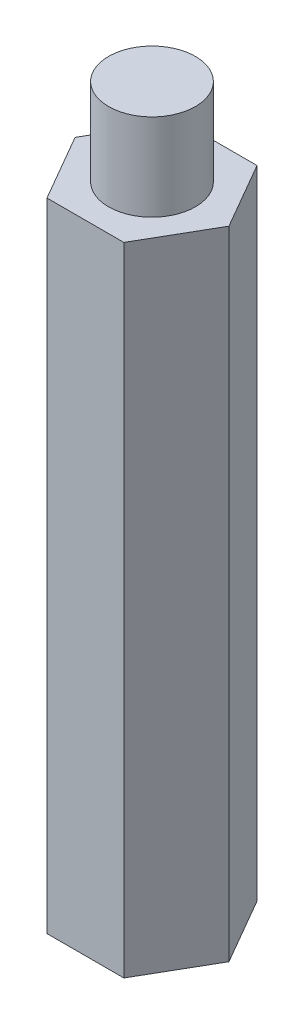
ISO-10303-21;
HEADER;
FILE_DESCRIPTION(('STEP AP214'),'2;1');
FILE_NAME('part.step','',(''),(''),'','','');
FILE_SCHEMA(('AUTOMOTIVE_DESIGN { 1 0 10303 214 1 1 1 1 }'));
ENDSEC;
DATA;
#1=APPLICATION_CONTEXT('core data for automotive mechanical design processes');
#2=APPLICATION_PROTOCOL_DEFINITION('international standard','automotive_design',2000,#1);
#3=PRODUCT_CONTEXT('',#1,'mechanical');
#4=PRODUCT('Part','Part','',(#3));
#5=PRODUCT_RELATED_PRODUCT_CATEGORY('part','',(#4));
#6=PRODUCT_DEFINITION_FORMATION('','',#4);
#7=PRODUCT_DEFINITION_CONTEXT('part definition',#1,'design');
#8=PRODUCT_DEFINITION('design','',#6,#7);
#9=PRODUCT_DEFINITION_SHAPE('','',#8);
#10=(LENGTH_UNIT() NAMED_UNIT(*) SI_UNIT(.MILLI.,.METRE.));
#11=(NAMED_UNIT(*) PLANE_ANGLE_UNIT() SI_UNIT($,.RADIAN.));
#12=(NAMED_UNIT(*) SI_UNIT($,.STERADIAN.) SOLID_ANGLE_UNIT());
#13=UNCERTAINTY_MEASURE_WITH_UNIT(LENGTH_MEASURE(1.E-05),#10,'distance_accuracy_value','');
#14=(GEOMETRIC_REPRESENTATION_CONTEXT(3) GLOBAL_UNCERTAINTY_ASSIGNED_CONTEXT((#13)) GLOBAL_UNIT_ASSIGNED_CONTEXT((#10,
#11,#12)) REPRESENTATION_CONTEXT('',''));
#15=CARTESIAN_POINT('',(0.,0.,0.));
#16=DIRECTION('',(0.,0.,1.));
#17=DIRECTION('',(1.,0.,0.));
#18=AXIS2_PLACEMENT_3D('',#15,#16,#17);
#19=CARTESIAN_POINT('',(1.32790561913614,22.,2.3));
#20=DIRECTION('',(-0.866025403784439,0.,-0.5));
#21=DIRECTION('',(-0.5,0.,0.866025403784439));
#22=AXIS2_PLACEMENT_3D('',#19,#20,#21);
#23=PLANE('',#22);
#24=DIRECTION('',(0.5,0.,-0.866025403784439));
#25=VECTOR('',#24,1.);
#26=CARTESIAN_POINT('',(1.32790561913614,0.,2.3));
#27=LINE('',#26,#25);
#28=CARTESIAN_POINT('',(1.32790561913614,0.,2.3));
#29=VERTEX_POINT('',#28);
#30=CARTESIAN_POINT('',(2.65581123827228,0.,0.));
#31=VERTEX_POINT('',#30);
#32=EDGE_CURVE('E125',#29,#31,#27,.T.);
#33=ORIENTED_EDGE('',*,*,#32,.T.);
#34=DIRECTION('',(0.,-1.,0.));
#35=VECTOR('',#34,1.);
#36=CARTESIAN_POINT('',(2.65581123827228,22.,0.));
#37=LINE('',#36,#35);
#38=CARTESIAN_POINT('',(2.65581123827228,22.,0.));
#39=VERTEX_POINT('',#38);
#40=EDGE_CURVE('E42',#39,#31,#37,.T.);
#41=ORIENTED_EDGE('',*,*,#40,.F.);
#42=DIRECTION('',(0.5,0.,-0.866025403784439));
#43=VECTOR('',#42,1.);
#44=CARTESIAN_POINT('',(1.32790561913614,22.,2.3));
#45=LINE('',#44,#43);
#46=CARTESIAN_POINT('',(1.32790561913614,22.,2.3));
#47=VERTEX_POINT('',#46);
#48=EDGE_CURVE('E136',#47,#39,#45,.T.);
#49=ORIENTED_EDGE('',*,*,#48,.F.);
#50=DIRECTION('',(0.,-1.,0.));
#51=VECTOR('',#50,1.);
#52=CARTESIAN_POINT('',(1.32790561913614,22.,2.3));
#53=LINE('',#52,#51);
#54=EDGE_CURVE('E121',#47,#29,#53,.T.);
#55=ORIENTED_EDGE('',*,*,#54,.T.);
#56=EDGE_LOOP('',(#33,#41,#49,#55));
#57=FACE_BOUND('',#56,.T.);
#58=ADVANCED_FACE('F39',(#57),#23,.F.);
#59=CARTESIAN_POINT('',(2.65581123827228,22.,0.));
#60=DIRECTION('',(-0.866025403784439,0.,0.5));
#61=DIRECTION('',(0.5,0.,0.866025403784439));
#62=AXIS2_PLACEMENT_3D('',#59,#60,#61);
#63=PLANE('',#62);
#64=DIRECTION('',(-0.5,0.,-0.866025403784438));
#65=VECTOR('',#64,1.);
#66=CARTESIAN_POINT('',(2.65581123827228,0.,0.));
#67=LINE('',#66,#65);
#68=CARTESIAN_POINT('',(1.32790561913614,0.,-2.3));
#69=VERTEX_POINT('',#68);
#70=EDGE_CURVE('E128',#31,#69,#67,.T.);
#71=ORIENTED_EDGE('',*,*,#70,.T.);
#72=DIRECTION('',(0.,-1.,0.));
#73=VECTOR('',#72,1.);
#74=CARTESIAN_POINT('',(1.32790561913614,22.,-2.3));
#75=LINE('',#74,#73);
#76=CARTESIAN_POINT('',(1.32790561913614,22.,-2.3));
#77=VERTEX_POINT('',#76);
#78=EDGE_CURVE('E139',#77,#69,#75,.T.);
#79=ORIENTED_EDGE('',*,*,#78,.F.);
#80=DIRECTION('',(-0.5,0.,-0.866025403784438));
#81=VECTOR('',#80,1.);
#82=CARTESIAN_POINT('',(2.65581123827228,22.,0.));
#83=LINE('',#82,#81);
#84=EDGE_CURVE('E94',#39,#77,#83,.T.);
#85=ORIENTED_EDGE('',*,*,#84,.F.);
#86=ORIENTED_EDGE('',*,*,#40,.T.);
#87=EDGE_LOOP('',(#71,#79,#85,#86));
#88=FACE_BOUND('',#87,.T.);
#89=ADVANCED_FACE('F144',(#88),#63,.F.);
#90=CARTESIAN_POINT('',(1.32790561913614,22.,-2.3));
#91=DIRECTION('',(0.,0.,1.));
#92=DIRECTION('',(1.,0.,0.));
#93=AXIS2_PLACEMENT_3D('',#90,#91,#92);
#94=PLANE('',#93);
#95=DIRECTION('',(-1.,0.,0.));
#96=VECTOR('',#95,1.);
#97=CARTESIAN_POINT('',(1.32790561913614,0.,-2.3));
#98=LINE('',#97,#96);
#99=CARTESIAN_POINT('',(-1.32790561913614,0.,-2.3));
#100=VERTEX_POINT('',#99);
#101=EDGE_CURVE('E131',#69,#100,#98,.T.);
#102=ORIENTED_EDGE('',*,*,#101,.T.);
#103=DIRECTION('',(0.,-1.,0.));
#104=VECTOR('',#103,1.);
#105=CARTESIAN_POINT('',(-1.32790561913614,22.,-2.3));
#106=LINE('',#105,#104);
#107=CARTESIAN_POINT('',(-1.32790561913614,22.,-2.3));
#108=VERTEX_POINT('',#107);
#109=EDGE_CURVE('E116',#108,#100,#106,.T.);
#110=ORIENTED_EDGE('',*,*,#109,.F.);
#111=DIRECTION('',(-1.,0.,0.));
#112=VECTOR('',#111,1.);
#113=CARTESIAN_POINT('',(1.32790561913614,22.,-2.3));
#114=LINE('',#113,#112);
#115=EDGE_CURVE('E107',#77,#108,#114,.T.);
#116=ORIENTED_EDGE('',*,*,#115,.F.);
#117=ORIENTED_EDGE('',*,*,#78,.T.);
#118=EDGE_LOOP('',(#102,#110,#116,#117));
#119=FACE_BOUND('',#118,.T.);
#120=ADVANCED_FACE('F150',(#119),#94,.F.);
#121=CARTESIAN_POINT('',(-1.32790561913614,22.,-2.3));
#122=DIRECTION('',(0.866025403784439,0.,0.5));
#123=DIRECTION('',(0.5,0.,-0.866025403784439));
#124=AXIS2_PLACEMENT_3D('',#121,#122,#123);
#125=PLANE('',#124);
#126=DIRECTION('',(-0.5,0.,0.866025403784439));
#127=VECTOR('',#126,1.);
#128=CARTESIAN_POINT('',(-1.32790561913614,0.,-2.3));
#129=LINE('',#128,#127);
#130=CARTESIAN_POINT('',(-2.65581123827228,0.,0.));
#131=VERTEX_POINT('',#130);
#132=EDGE_CURVE('E115',#100,#131,#129,.T.);
#133=ORIENTED_EDGE('',*,*,#132,.T.);
#134=DIRECTION('',(0.,-1.,0.));
#135=VECTOR('',#134,1.);
#136=CARTESIAN_POINT('',(-2.65581123827228,22.,0.));
#137=LINE('',#136,#135);
#138=CARTESIAN_POINT('',(-2.65581123827228,22.,0.));
#139=VERTEX_POINT('',#138);
#140=EDGE_CURVE('E112',#139,#131,#137,.T.);
#141=ORIENTED_EDGE('',*,*,#140,.F.);
#142=DIRECTION('',(-0.5,0.,0.866025403784439));
#143=VECTOR('',#142,1.);
#144=CARTESIAN_POINT('',(-1.32790561913614,22.,-2.3));
#145=LINE('',#144,#143);
#146=EDGE_CURVE('E101',#108,#139,#145,.T.);
#147=ORIENTED_EDGE('',*,*,#146,.F.);
#148=ORIENTED_EDGE('',*,*,#109,.T.);
#149=EDGE_LOOP('',(#133,#141,#147,#148));
#150=FACE_BOUND('',#149,.T.);
#151=ADVANCED_FACE('F113',(#150),#125,.F.);
#152=CARTESIAN_POINT('',(-2.65581123827228,22.,0.));
#153=DIRECTION('',(0.866025403784439,0.,-0.5));
#154=DIRECTION('',(-0.5,0.,-0.866025403784439));
#155=AXIS2_PLACEMENT_3D('',#152,#153,#154);
#156=PLANE('',#155);
#157=DIRECTION('',(0.5,0.,0.866025403784438));
#158=VECTOR('',#157,1.);
#159=CARTESIAN_POINT('',(-2.65581123827228,0.,0.));
#160=LINE('',#159,#158);
#161=CARTESIAN_POINT('',(-1.32790561913614,0.,2.3));
#162=VERTEX_POINT('',#161);
#163=EDGE_CURVE('E79',#131,#162,#160,.T.);
#164=ORIENTED_EDGE('',*,*,#163,.T.);
#165=DIRECTION('',(0.,-1.,0.));
#166=VECTOR('',#165,1.);
#167=CARTESIAN_POINT('',(-1.32790561913614,22.,2.3));
#168=LINE('',#167,#166);
#169=CARTESIAN_POINT('',(-1.32790561913614,22.,2.3));
#170=VERTEX_POINT('',#169);
#171=EDGE_CURVE('E117',#170,#162,#168,.T.);
#172=ORIENTED_EDGE('',*,*,#171,.F.);
#173=DIRECTION('',(0.5,0.,0.866025403784438));
#174=VECTOR('',#173,1.);
#175=CARTESIAN_POINT('',(-2.65581123827228,22.,0.));
#176=LINE('',#175,#174);
#177=EDGE_CURVE('E105',#139,#170,#176,.T.);
#178=ORIENTED_EDGE('',*,*,#177,.F.);
#179=ORIENTED_EDGE('',*,*,#140,.T.);
#180=EDGE_LOOP('',(#164,#172,#178,#179));
#181=FACE_BOUND('',#180,.T.);
#182=ADVANCED_FACE('F119',(#181),#156,.F.);
#183=CARTESIAN_POINT('',(-1.32790561913614,22.,2.3));
#184=DIRECTION('',(0.,0.,-1.));
#185=DIRECTION('',(-1.,0.,0.));
#186=AXIS2_PLACEMENT_3D('',#183,#184,#185);
#187=PLANE('',#186);
#188=DIRECTION('',(1.,0.,0.));
#189=VECTOR('',#188,1.);
#190=CARTESIAN_POINT('',(-1.32790561913614,0.,2.3));
#191=LINE('',#190,#189);
#192=EDGE_CURVE('E85',#162,#29,#191,.T.);
#193=ORIENTED_EDGE('',*,*,#192,.T.);
#194=ORIENTED_EDGE('',*,*,#54,.F.);
#195=DIRECTION('',(1.,0.,0.));
#196=VECTOR('',#195,1.);
#197=CARTESIAN_POINT('',(-1.32790561913614,22.,2.3));
#198=LINE('',#197,#196);
#199=EDGE_CURVE('E56',#170,#47,#198,.T.);
#200=ORIENTED_EDGE('',*,*,#199,.F.);
#201=ORIENTED_EDGE('',*,*,#171,.T.);
#202=EDGE_LOOP('',(#193,#194,#200,#201));
#203=FACE_BOUND('',#202,.T.);
#204=ADVANCED_FACE('F182',(#203),#187,.F.);
#205=CARTESIAN_POINT('',(0.,22.,0.));
#206=DIRECTION('',(0.,1.,0.));
#207=DIRECTION('',(0.,0.,1.));
#208=AXIS2_PLACEMENT_3D('',#205,#206,#207);
#209=PLANE('',#208);
#210=CARTESIAN_POINT('',(0.,22.,0.));
#211=DIRECTION('',(0.,1.,0.));
#212=DIRECTION('',(0.,0.,1.));
#213=AXIS2_PLACEMENT_3D('',#210,#211,#212);
#214=CIRCLE('',#213,1.5);
#215=CARTESIAN_POINT('',(0.,22.,1.5));
#216=VERTEX_POINT('',#215);
#217=EDGE_CURVE('E11',#216,#216,#214,.T.);
#218=ORIENTED_EDGE('',*,*,#217,.F.);
#219=EDGE_LOOP('',(#218));
#220=FACE_BOUND('',#219,.T.);
#221=ORIENTED_EDGE('',*,*,#48,.T.);
#222=ORIENTED_EDGE('',*,*,#84,.T.);
#223=ORIENTED_EDGE('',*,*,#115,.T.);
#224=ORIENTED_EDGE('',*,*,#146,.T.);
#225=ORIENTED_EDGE('',*,*,#177,.T.);
#226=ORIENTED_EDGE('',*,*,#199,.T.);
#227=EDGE_LOOP('',(#221,#222,#223,#224,#225,#226));
#228=FACE_BOUND('',#227,.T.);
#229=ADVANCED_FACE('F103',(#220,#228),#209,.T.);
#230=CARTESIAN_POINT('',(0.,0.,0.));
#231=DIRECTION('',(0.,1.,0.));
#232=DIRECTION('',(0.,0.,1.));
#233=AXIS2_PLACEMENT_3D('',#230,#231,#232);
#234=PLANE('',#233);
#235=CARTESIAN_POINT('',(0.,0.,0.));
#236=DIRECTION('',(0.,-1.,0.));
#237=DIRECTION('',(0.,0.,-1.));
#238=AXIS2_PLACEMENT_3D('',#235,#236,#237);
#239=CIRCLE('',#238,1.5);
#240=CARTESIAN_POINT('',(0.,0.,-1.5));
#241=VERTEX_POINT('',#240);
#242=EDGE_CURVE('E157',#241,#241,#239,.T.);
#243=ORIENTED_EDGE('',*,*,#242,.F.);
#244=EDGE_LOOP('',(#243));
#245=FACE_BOUND('',#244,.T.);
#246=ORIENTED_EDGE('',*,*,#32,.F.);
#247=ORIENTED_EDGE('',*,*,#192,.F.);
#248=ORIENTED_EDGE('',*,*,#163,.F.);
#249=ORIENTED_EDGE('',*,*,#132,.F.);
#250=ORIENTED_EDGE('',*,*,#101,.F.);
#251=ORIENTED_EDGE('',*,*,#70,.F.);
#252=EDGE_LOOP('',(#246,#247,#248,#249,#250,#251));
#253=FACE_BOUND('',#252,.T.);
#254=ADVANCED_FACE('F149',(#245,#253),#234,.F.);
#255=CARTESIAN_POINT('',(0.,25.,0.));
#256=DIRECTION('',(0.,-1.,0.));
#257=DIRECTION('',(0.,0.,-1.));
#258=AXIS2_PLACEMENT_3D('',#255,#256,#257);
#259=CYLINDRICAL_SURFACE('',#258,1.5);
#260=CARTESIAN_POINT('',(0.,25.,0.));
#261=DIRECTION('',(0.,1.,0.));
#262=DIRECTION('',(0.,0.,1.));
#263=AXIS2_PLACEMENT_3D('',#260,#261,#262);
#264=CIRCLE('',#263,1.5);
#265=CARTESIAN_POINT('',(0.,25.,1.5));
#266=VERTEX_POINT('',#265);
#267=EDGE_CURVE('E129',#266,#266,#264,.T.);
#268=ORIENTED_EDGE('',*,*,#267,.F.);
#269=EDGE_LOOP('',(#268));
#270=FACE_BOUND('',#269,.T.);
#271=ORIENTED_EDGE('',*,*,#217,.T.);
#272=EDGE_LOOP('',(#271));
#273=FACE_BOUND('',#272,.T.);
#274=ADVANCED_FACE('F173',(#270,#273),#259,.T.);
#275=CARTESIAN_POINT('',(0.,25.,0.));
#276=DIRECTION('',(0.,1.,0.));
#277=DIRECTION('',(0.,0.,1.));
#278=AXIS2_PLACEMENT_3D('',#275,#276,#277);
#279=PLANE('',#278);
#280=ORIENTED_EDGE('',*,*,#267,.T.);
#281=EDGE_LOOP('',(#280));
#282=FACE_BOUND('',#281,.T.);
#283=ADVANCED_FACE('F168',(#282),#279,.T.);
#284=CARTESIAN_POINT('',(0.,3.,0.));
#285=DIRECTION('',(0.,-1.,0.));
#286=DIRECTION('',(0.,0.,-1.));
#287=AXIS2_PLACEMENT_3D('',#284,#285,#286);
#288=CYLINDRICAL_SURFACE('',#287,1.5);
#289=CARTESIAN_POINT('',(0.,3.,0.));
#290=DIRECTION('',(0.,-1.,0.));
#291=DIRECTION('',(0.,0.,-1.));
#292=AXIS2_PLACEMENT_3D('',#289,#290,#291);
#293=CIRCLE('',#292,1.5);
#294=CARTESIAN_POINT('',(0.,3.,-1.5));
#295=VERTEX_POINT('',#294);
#296=EDGE_CURVE('E156',#295,#295,#293,.T.);
#297=ORIENTED_EDGE('',*,*,#296,.F.);
#298=EDGE_LOOP('',(#297));
#299=FACE_BOUND('',#298,.T.);
#300=ORIENTED_EDGE('',*,*,#242,.T.);
#301=EDGE_LOOP('',(#300));
#302=FACE_BOUND('',#301,.T.);
#303=ADVANCED_FACE('F165',(#299,#302),#288,.F.);
#304=CARTESIAN_POINT('',(0.,3.,0.));
#305=DIRECTION('',(0.,-1.,0.));
#306=DIRECTION('',(0.,0.,-1.));
#307=AXIS2_PLACEMENT_3D('',#304,#305,#306);
#308=PLANE('',#307);
#309=ORIENTED_EDGE('',*,*,#296,.T.);
#310=EDGE_LOOP('',(#309));
#311=FACE_BOUND('',#310,.T.);
#312=ADVANCED_FACE('F163',(#311),#308,.T.);
#313=CLOSED_SHELL('',(#58,#89,#120,#151,#182,#204,#229,#254,#274,#283,#303,#312));
#314=MANIFOLD_SOLID_BREP('B2',#313);
#315=ADVANCED_BREP_SHAPE_REPRESENTATION('',(#18,#314),#14);
#316=SHAPE_DEFINITION_REPRESENTATION(#9,#315);
ENDSEC;
END-ISO-10303-21;
